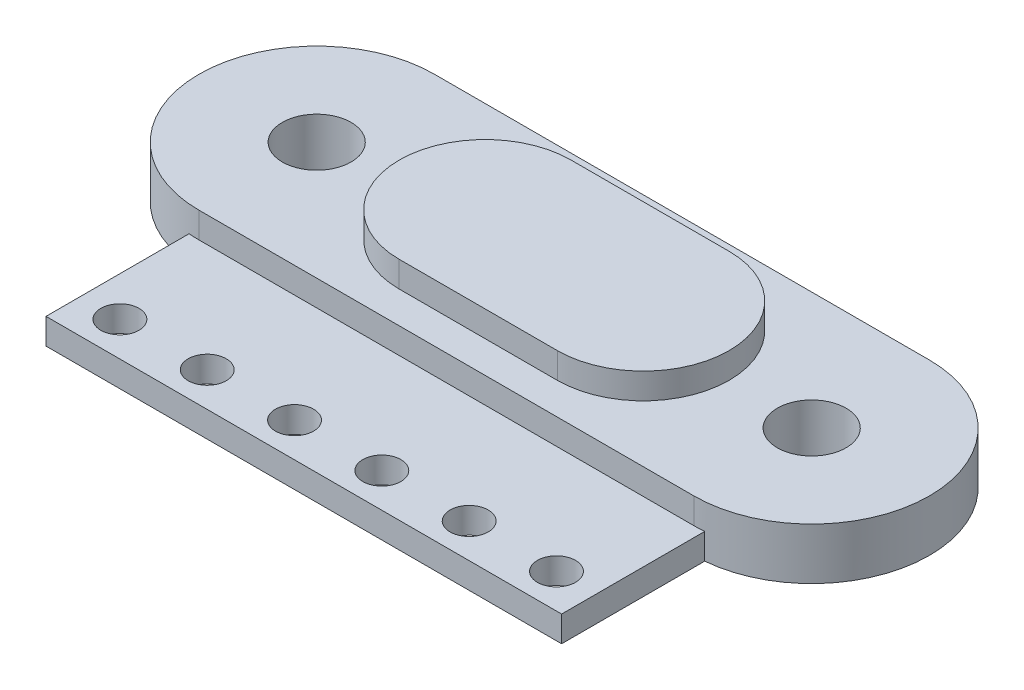
ISO-10303-21;
HEADER;
FILE_DESCRIPTION(('STEP AP214'),'2;1');
FILE_NAME('part.step','',(''),(''),'','','');
FILE_SCHEMA(('AUTOMOTIVE_DESIGN { 1 0 10303 214 1 1 1 1 }'));
ENDSEC;
DATA;
#1=APPLICATION_CONTEXT('core data for automotive mechanical design processes');
#2=APPLICATION_PROTOCOL_DEFINITION('international standard','automotive_design',2000,#1);
#3=PRODUCT_CONTEXT('',#1,'mechanical');
#4=PRODUCT('Part','Part','',(#3));
#5=PRODUCT_RELATED_PRODUCT_CATEGORY('part','',(#4));
#6=PRODUCT_DEFINITION_FORMATION('','',#4);
#7=PRODUCT_DEFINITION_CONTEXT('part definition',#1,'design');
#8=PRODUCT_DEFINITION('design','',#6,#7);
#9=PRODUCT_DEFINITION_SHAPE('','',#8);
#10=(LENGTH_UNIT() NAMED_UNIT(*) SI_UNIT(.MILLI.,.METRE.));
#11=(NAMED_UNIT(*) PLANE_ANGLE_UNIT() SI_UNIT($,.RADIAN.));
#12=(NAMED_UNIT(*) SI_UNIT($,.STERADIAN.) SOLID_ANGLE_UNIT());
#13=UNCERTAINTY_MEASURE_WITH_UNIT(LENGTH_MEASURE(1.E-05),#10,'distance_accuracy_value','');
#14=(GEOMETRIC_REPRESENTATION_CONTEXT(3) GLOBAL_UNCERTAINTY_ASSIGNED_CONTEXT((#13)) GLOBAL_UNIT_ASSIGNED_CONTEXT((#10,
#11,#12)) REPRESENTATION_CONTEXT('',''));
#15=CARTESIAN_POINT('',(0.,0.,0.));
#16=DIRECTION('',(0.,0.,1.));
#17=DIRECTION('',(1.,0.,0.));
#18=AXIS2_PLACEMENT_3D('',#15,#16,#17);
#19=CARTESIAN_POINT('',(-14.4,1.5,0.));
#20=DIRECTION('',(0.,1.,0.));
#21=DIRECTION('',(0.,0.,1.));
#22=AXIS2_PLACEMENT_3D('',#19,#20,#21);
#23=PLANE('',#22);
#24=CARTESIAN_POINT('',(-14.4,1.5,0.));
#25=DIRECTION('',(0.,1.,0.));
#26=DIRECTION('',(0.,0.,1.));
#27=AXIS2_PLACEMENT_3D('',#24,#25,#26);
#28=CIRCLE('',#27,1.);
#29=CARTESIAN_POINT('',(-14.4,1.5,1.));
#30=VERTEX_POINT('',#29);
#31=EDGE_CURVE('E334',#30,#30,#28,.T.);
#32=ORIENTED_EDGE('',*,*,#31,.F.);
#33=EDGE_LOOP('',(#32));
#34=FACE_BOUND('',#33,.T.);
#35=CARTESIAN_POINT('',(-14.4,1.5,0.));
#36=DIRECTION('',(0.,1.,0.));
#37=DIRECTION('',(0.,0.,1.));
#38=AXIS2_PLACEMENT_3D('',#35,#36,#37);
#39=CIRCLE('',#38,3.425);
#40=CARTESIAN_POINT('',(-14.4,1.5,-3.425));
#41=VERTEX_POINT('',#40);
#42=CARTESIAN_POINT('',(-14.4,1.5,3.425));
#43=VERTEX_POINT('',#42);
#44=EDGE_CURVE('E331',#41,#43,#39,.T.);
#45=ORIENTED_EDGE('',*,*,#44,.T.);
#46=DIRECTION('',(1.,0.,0.));
#47=VECTOR('',#46,1.);
#48=CARTESIAN_POINT('',(-14.4,1.5,3.425));
#49=LINE('',#48,#47);
#50=CARTESIAN_POINT('',(0.,1.5,3.425));
#51=VERTEX_POINT('',#50);
#52=EDGE_CURVE('E328',#43,#51,#49,.T.);
#53=ORIENTED_EDGE('',*,*,#52,.T.);
#54=CARTESIAN_POINT('',(0.,1.5,0.));
#55=DIRECTION('',(0.,1.,0.));
#56=DIRECTION('',(0.,0.,1.));
#57=AXIS2_PLACEMENT_3D('',#54,#55,#56);
#58=CIRCLE('',#57,3.425);
#59=CARTESIAN_POINT('',(0.,1.5,-3.425));
#60=VERTEX_POINT('',#59);
#61=EDGE_CURVE('E326',#51,#60,#58,.T.);
#62=ORIENTED_EDGE('',*,*,#61,.T.);
#63=DIRECTION('',(1.,0.,0.));
#64=VECTOR('',#63,1.);
#65=CARTESIAN_POINT('',(-14.4,1.5,-3.425));
#66=LINE('',#65,#64);
#67=EDGE_CURVE('E196',#41,#60,#66,.T.);
#68=ORIENTED_EDGE('',*,*,#67,.F.);
#69=EDGE_LOOP('',(#45,#53,#62,#68));
#70=FACE_BOUND('',#69,.T.);
#71=CARTESIAN_POINT('',(0.,1.5,0.));
#72=DIRECTION('',(0.,1.,0.));
#73=DIRECTION('',(0.,0.,1.));
#74=AXIS2_PLACEMENT_3D('',#71,#72,#73);
#75=CIRCLE('',#74,1.);
#76=CARTESIAN_POINT('',(0.,1.5,1.));
#77=VERTEX_POINT('',#76);
#78=EDGE_CURVE('E337',#77,#77,#75,.T.);
#79=ORIENTED_EDGE('',*,*,#78,.F.);
#80=EDGE_LOOP('',(#79));
#81=FACE_BOUND('',#80,.T.);
#82=DIRECTION('',(1.,0.,0.));
#83=VECTOR('',#82,1.);
#84=CARTESIAN_POINT('',(-9.5,1.5,2.5));
#85=LINE('',#84,#83);
#86=CARTESIAN_POINT('',(-9.5,1.5,2.5));
#87=VERTEX_POINT('',#86);
#88=CARTESIAN_POINT('',(-4.9,1.5,2.5));
#89=VERTEX_POINT('',#88);
#90=EDGE_CURVE('E356',#87,#89,#85,.T.);
#91=ORIENTED_EDGE('',*,*,#90,.F.);
#92=CARTESIAN_POINT('',(-9.5,1.5,0.));
#93=DIRECTION('',(0.,1.,0.));
#94=DIRECTION('',(0.,0.,1.));
#95=AXIS2_PLACEMENT_3D('',#92,#93,#94);
#96=CIRCLE('',#95,2.5);
#97=CARTESIAN_POINT('',(-9.5,1.5,-2.5));
#98=VERTEX_POINT('',#97);
#99=EDGE_CURVE('E359',#98,#87,#96,.T.);
#100=ORIENTED_EDGE('',*,*,#99,.F.);
#101=DIRECTION('',(-1.,0.,0.));
#102=VECTOR('',#101,1.);
#103=CARTESIAN_POINT('',(-9.5,1.5,-2.5));
#104=LINE('',#103,#102);
#105=CARTESIAN_POINT('',(-4.9,1.5,-2.5));
#106=VERTEX_POINT('',#105);
#107=EDGE_CURVE('E351',#106,#98,#104,.T.);
#108=ORIENTED_EDGE('',*,*,#107,.F.);
#109=CARTESIAN_POINT('',(-4.9,1.5,0.));
#110=DIRECTION('',(0.,1.,0.));
#111=DIRECTION('',(0.,0.,1.));
#112=AXIS2_PLACEMENT_3D('',#109,#110,#111);
#113=CIRCLE('',#112,2.5);
#114=EDGE_CURVE('E354',#89,#106,#113,.T.);
#115=ORIENTED_EDGE('',*,*,#114,.F.);
#116=EDGE_LOOP('',(#91,#100,#108,#115));
#117=FACE_BOUND('',#116,.T.);
#118=ADVANCED_FACE('F72',(#34,#70,#81,#117),#23,.T.);
#119=CARTESIAN_POINT('',(0.,0.75,0.));
#120=DIRECTION('',(0.,1.,0.));
#121=DIRECTION('',(0.,0.,1.));
#122=AXIS2_PLACEMENT_3D('',#119,#120,#121);
#123=PLANE('',#122);
#124=CARTESIAN_POINT('',(-0.849999999999998,0.75,6.575));
#125=DIRECTION('',(0.,1.,0.));
#126=DIRECTION('',(0.,0.,1.));
#127=AXIS2_PLACEMENT_3D('',#124,#125,#126);
#128=CIRCLE('',#127,0.554445531954672);
#129=CARTESIAN_POINT('',(-0.849999999999998,0.75,7.12944553195467));
#130=VERTEX_POINT('',#129);
#131=EDGE_CURVE('E128',#130,#130,#128,.F.);
#132=ORIENTED_EDGE('',*,*,#131,.T.);
#133=EDGE_LOOP('',(#132));
#134=FACE_BOUND('',#133,.T.);
#135=CARTESIAN_POINT('',(-5.93,0.75,6.575));
#136=DIRECTION('',(0.,1.,0.));
#137=DIRECTION('',(0.,0.,1.));
#138=AXIS2_PLACEMENT_3D('',#135,#136,#137);
#139=CIRCLE('',#138,0.554445531954672);
#140=CARTESIAN_POINT('',(-5.93,0.75,7.12944553195467));
#141=VERTEX_POINT('',#140);
#142=EDGE_CURVE('E228',#141,#141,#139,.F.);
#143=ORIENTED_EDGE('',*,*,#142,.T.);
#144=EDGE_LOOP('',(#143));
#145=FACE_BOUND('',#144,.T.);
#146=CARTESIAN_POINT('',(-13.55,0.75,6.575));
#147=DIRECTION('',(0.,1.,0.));
#148=DIRECTION('',(0.,0.,1.));
#149=AXIS2_PLACEMENT_3D('',#146,#147,#148);
#150=CIRCLE('',#149,0.554445531954672);
#151=CARTESIAN_POINT('',(-13.55,0.75,7.12944553195467));
#152=VERTEX_POINT('',#151);
#153=EDGE_CURVE('E226',#152,#152,#150,.T.);
#154=ORIENTED_EDGE('',*,*,#153,.F.);
#155=EDGE_LOOP('',(#154));
#156=FACE_BOUND('',#155,.T.);
#157=CARTESIAN_POINT('',(-11.01,0.75,6.575));
#158=DIRECTION('',(0.,1.,0.));
#159=DIRECTION('',(0.,0.,1.));
#160=AXIS2_PLACEMENT_3D('',#157,#158,#159);
#161=CIRCLE('',#160,0.554445531954671);
#162=CARTESIAN_POINT('',(-11.01,0.75,7.12944553195467));
#163=VERTEX_POINT('',#162);
#164=EDGE_CURVE('E223',#163,#163,#161,.T.);
#165=ORIENTED_EDGE('',*,*,#164,.F.);
#166=EDGE_LOOP('',(#165));
#167=FACE_BOUND('',#166,.T.);
#168=CARTESIAN_POINT('',(-8.47,0.75,6.575));
#169=DIRECTION('',(0.,1.,0.));
#170=DIRECTION('',(0.,0.,1.));
#171=AXIS2_PLACEMENT_3D('',#168,#169,#170);
#172=CIRCLE('',#171,0.554445531954672);
#173=CARTESIAN_POINT('',(-8.47,0.75,7.12944553195467));
#174=VERTEX_POINT('',#173);
#175=EDGE_CURVE('E220',#174,#174,#172,.T.);
#176=ORIENTED_EDGE('',*,*,#175,.F.);
#177=EDGE_LOOP('',(#176));
#178=FACE_BOUND('',#177,.T.);
#179=CARTESIAN_POINT('',(-3.39,0.75,6.575));
#180=DIRECTION('',(0.,1.,0.));
#181=DIRECTION('',(0.,0.,1.));
#182=AXIS2_PLACEMENT_3D('',#179,#180,#181);
#183=CIRCLE('',#182,0.55444553195467);
#184=CARTESIAN_POINT('',(-3.39,0.75,7.12944553195467));
#185=VERTEX_POINT('',#184);
#186=EDGE_CURVE('E214',#185,#185,#183,.F.);
#187=ORIENTED_EDGE('',*,*,#186,.T.);
#188=EDGE_LOOP('',(#187));
#189=FACE_BOUND('',#188,.T.);
#190=DIRECTION('',(-1.,0.,0.));
#191=VECTOR('',#190,1.);
#192=CARTESIAN_POINT('',(0.,0.75,3.425));
#193=LINE('',#192,#191);
#194=CARTESIAN_POINT('',(0.,0.75,3.425));
#195=VERTEX_POINT('',#194);
#196=CARTESIAN_POINT('',(-14.4,0.75,3.425));
#197=VERTEX_POINT('',#196);
#198=EDGE_CURVE('E151',#195,#197,#193,.T.);
#199=ORIENTED_EDGE('',*,*,#198,.T.);
#200=CARTESIAN_POINT('',(-14.4,0.75,0.));
#201=DIRECTION('',(0.,1.,0.));
#202=DIRECTION('',(0.,0.,1.));
#203=AXIS2_PLACEMENT_3D('',#200,#201,#202);
#204=CIRCLE('',#203,3.425);
#205=CARTESIAN_POINT('',(-14.7,0.75,3.41183601598904));
#206=VERTEX_POINT('',#205);
#207=EDGE_CURVE('E146',#197,#206,#204,.F.);
#208=ORIENTED_EDGE('',*,*,#207,.T.);
#209=DIRECTION('',(0.,0.,1.));
#210=VECTOR('',#209,1.);
#211=CARTESIAN_POINT('',(-14.7,0.75,0.));
#212=LINE('',#211,#210);
#213=CARTESIAN_POINT('',(-14.7,0.75,7.575));
#214=VERTEX_POINT('',#213);
#215=EDGE_CURVE('E211',#206,#214,#212,.T.);
#216=ORIENTED_EDGE('',*,*,#215,.T.);
#217=DIRECTION('',(1.,0.,0.));
#218=VECTOR('',#217,1.);
#219=CARTESIAN_POINT('',(0.,0.75,7.575));
#220=LINE('',#219,#218);
#221=CARTESIAN_POINT('',(0.3,0.75,7.575));
#222=VERTEX_POINT('',#221);
#223=EDGE_CURVE('E96',#214,#222,#220,.T.);
#224=ORIENTED_EDGE('',*,*,#223,.T.);
#225=DIRECTION('',(0.,0.,1.));
#226=VECTOR('',#225,1.);
#227=CARTESIAN_POINT('',(0.3,0.75,0.));
#228=LINE('',#227,#226);
#229=CARTESIAN_POINT('',(0.3,0.75,3.41183601598904));
#230=VERTEX_POINT('',#229);
#231=EDGE_CURVE('E125',#230,#222,#228,.T.);
#232=ORIENTED_EDGE('',*,*,#231,.F.);
#233=CARTESIAN_POINT('',(0.,0.75,0.));
#234=DIRECTION('',(0.,1.,0.));
#235=DIRECTION('',(0.,0.,1.));
#236=AXIS2_PLACEMENT_3D('',#233,#234,#235);
#237=CIRCLE('',#236,3.425);
#238=EDGE_CURVE('E312',#230,#195,#237,.F.);
#239=ORIENTED_EDGE('',*,*,#238,.T.);
#240=EDGE_LOOP('',(#199,#208,#216,#224,#232,#239));
#241=FACE_BOUND('',#240,.T.);
#242=ADVANCED_FACE('F235',(#134,#145,#156,#167,#178,#189,#241),#123,.T.);
#243=CARTESIAN_POINT('',(0.3,0.75,0.));
#244=DIRECTION('',(1.,0.,0.));
#245=DIRECTION('',(0.,0.,-1.));
#246=AXIS2_PLACEMENT_3D('',#243,#244,#245);
#247=PLANE('',#246);
#248=DIRECTION('',(0.,0.,1.));
#249=VECTOR('',#248,1.);
#250=CARTESIAN_POINT('',(0.3,0.,0.));
#251=LINE('',#250,#249);
#252=CARTESIAN_POINT('',(0.3,0.,3.41183601598904));
#253=VERTEX_POINT('',#252);
#254=CARTESIAN_POINT('',(0.3,0.,7.575));
#255=VERTEX_POINT('',#254);
#256=EDGE_CURVE('E124',#253,#255,#251,.T.);
#257=ORIENTED_EDGE('',*,*,#256,.F.);
#258=DIRECTION('',(0.,-1.,0.));
#259=VECTOR('',#258,1.);
#260=CARTESIAN_POINT('',(0.3,0.75,3.41183601598904));
#261=LINE('',#260,#259);
#262=EDGE_CURVE('E12',#230,#253,#261,.T.);
#263=ORIENTED_EDGE('',*,*,#262,.F.);
#264=ORIENTED_EDGE('',*,*,#231,.T.);
#265=DIRECTION('',(0.,-1.,0.));
#266=VECTOR('',#265,1.);
#267=CARTESIAN_POINT('',(0.3,0.75,7.575));
#268=LINE('',#267,#266);
#269=EDGE_CURVE('E120',#222,#255,#268,.T.);
#270=ORIENTED_EDGE('',*,*,#269,.T.);
#271=EDGE_LOOP('',(#257,#263,#264,#270));
#272=FACE_BOUND('',#271,.T.);
#273=ADVANCED_FACE('F74',(#272),#247,.T.);
#274=CARTESIAN_POINT('',(0.,0.75,0.));
#275=DIRECTION('',(0.,-1.,0.));
#276=DIRECTION('',(0.,0.,-1.));
#277=AXIS2_PLACEMENT_3D('',#274,#275,#276);
#278=CYLINDRICAL_SURFACE('',#277,3.425);
#279=CARTESIAN_POINT('',(0.,0.,0.));
#280=DIRECTION('',(0.,1.,0.));
#281=DIRECTION('',(0.,0.,1.));
#282=AXIS2_PLACEMENT_3D('',#279,#280,#281);
#283=CIRCLE('',#282,3.425);
#284=CARTESIAN_POINT('',(0.,0.,-3.425));
#285=VERTEX_POINT('',#284);
#286=EDGE_CURVE('E145',#253,#285,#283,.T.);
#287=ORIENTED_EDGE('',*,*,#286,.T.);
#288=DIRECTION('',(0.,-1.,0.));
#289=VECTOR('',#288,1.);
#290=CARTESIAN_POINT('',(0.,0.75,-3.425));
#291=LINE('',#290,#289);
#292=EDGE_CURVE('E80',#60,#285,#291,.T.);
#293=ORIENTED_EDGE('',*,*,#292,.F.);
#294=ORIENTED_EDGE('',*,*,#61,.F.);
#295=DIRECTION('',(0.,-1.,0.));
#296=VECTOR('',#295,1.);
#297=CARTESIAN_POINT('',(0.,1.5,3.425));
#298=LINE('',#297,#296);
#299=EDGE_CURVE('E323',#51,#195,#298,.T.);
#300=ORIENTED_EDGE('',*,*,#299,.T.);
#301=ORIENTED_EDGE('',*,*,#238,.F.);
#302=ORIENTED_EDGE('',*,*,#262,.T.);
#303=EDGE_LOOP('',(#287,#293,#294,#300,#301,#302));
#304=FACE_BOUND('',#303,.T.);
#305=ADVANCED_FACE('F200',(#304),#278,.T.);
#306=CARTESIAN_POINT('',(0.,0.75,-3.425));
#307=DIRECTION('',(0.,0.,-1.));
#308=DIRECTION('',(-1.,0.,0.));
#309=AXIS2_PLACEMENT_3D('',#306,#307,#308);
#310=PLANE('',#309);
#311=DIRECTION('',(1.,0.,0.));
#312=VECTOR('',#311,1.);
#313=CARTESIAN_POINT('',(0.,0.,-3.425));
#314=LINE('',#313,#312);
#315=CARTESIAN_POINT('',(-14.4,0.,-3.425));
#316=VERTEX_POINT('',#315);
#317=EDGE_CURVE('E148',#316,#285,#314,.T.);
#318=ORIENTED_EDGE('',*,*,#317,.F.);
#319=DIRECTION('',(0.,-1.,0.));
#320=VECTOR('',#319,1.);
#321=CARTESIAN_POINT('',(-14.4,0.75,-3.425));
#322=LINE('',#321,#320);
#323=EDGE_CURVE('E187',#41,#316,#322,.T.);
#324=ORIENTED_EDGE('',*,*,#323,.F.);
#325=ORIENTED_EDGE('',*,*,#67,.T.);
#326=ORIENTED_EDGE('',*,*,#292,.T.);
#327=EDGE_LOOP('',(#318,#324,#325,#326));
#328=FACE_BOUND('',#327,.T.);
#329=ADVANCED_FACE('F192',(#328),#310,.T.);
#330=CARTESIAN_POINT('',(-14.4,0.75,0.));
#331=DIRECTION('',(0.,-1.,0.));
#332=DIRECTION('',(0.,0.,-1.));
#333=AXIS2_PLACEMENT_3D('',#330,#331,#332);
#334=CYLINDRICAL_SURFACE('',#333,3.425);
#335=CARTESIAN_POINT('',(-14.4,0.,0.));
#336=DIRECTION('',(0.,1.,0.));
#337=DIRECTION('',(0.,0.,1.));
#338=AXIS2_PLACEMENT_3D('',#335,#336,#337);
#339=CIRCLE('',#338,3.425);
#340=CARTESIAN_POINT('',(-14.7,0.,3.41183601598904));
#341=VERTEX_POINT('',#340);
#342=EDGE_CURVE('E157',#316,#341,#339,.T.);
#343=ORIENTED_EDGE('',*,*,#342,.T.);
#344=DIRECTION('',(0.,-1.,0.));
#345=VECTOR('',#344,1.);
#346=CARTESIAN_POINT('',(-14.7,0.75,3.41183601598904));
#347=LINE('',#346,#345);
#348=EDGE_CURVE('E184',#206,#341,#347,.T.);
#349=ORIENTED_EDGE('',*,*,#348,.F.);
#350=ORIENTED_EDGE('',*,*,#207,.F.);
#351=DIRECTION('',(0.,-1.,0.));
#352=VECTOR('',#351,1.);
#353=CARTESIAN_POINT('',(-14.4,1.5,3.425));
#354=LINE('',#353,#352);
#355=EDGE_CURVE('E319',#43,#197,#354,.T.);
#356=ORIENTED_EDGE('',*,*,#355,.F.);
#357=ORIENTED_EDGE('',*,*,#44,.F.);
#358=ORIENTED_EDGE('',*,*,#323,.T.);
#359=EDGE_LOOP('',(#343,#349,#350,#356,#357,#358));
#360=FACE_BOUND('',#359,.T.);
#361=ADVANCED_FACE('F205',(#360),#334,.T.);
#362=CARTESIAN_POINT('',(-14.7,0.75,0.));
#363=DIRECTION('',(1.,0.,0.));
#364=DIRECTION('',(0.,0.,-1.));
#365=AXIS2_PLACEMENT_3D('',#362,#363,#364);
#366=PLANE('',#365);
#367=DIRECTION('',(0.,0.,1.));
#368=VECTOR('',#367,1.);
#369=CARTESIAN_POINT('',(-14.7,0.,0.));
#370=LINE('',#369,#368);
#371=CARTESIAN_POINT('',(-14.7,0.,7.575));
#372=VERTEX_POINT('',#371);
#373=EDGE_CURVE('E138',#341,#372,#370,.T.);
#374=ORIENTED_EDGE('',*,*,#373,.T.);
#375=DIRECTION('',(0.,-1.,0.));
#376=VECTOR('',#375,1.);
#377=CARTESIAN_POINT('',(-14.7,0.75,7.575));
#378=LINE('',#377,#376);
#379=EDGE_CURVE('E127',#214,#372,#378,.T.);
#380=ORIENTED_EDGE('',*,*,#379,.F.);
#381=ORIENTED_EDGE('',*,*,#215,.F.);
#382=ORIENTED_EDGE('',*,*,#348,.T.);
#383=EDGE_LOOP('',(#374,#380,#381,#382));
#384=FACE_BOUND('',#383,.T.);
#385=ADVANCED_FACE('F210',(#384),#366,.F.);
#386=CARTESIAN_POINT('',(-5.93,0.75,6.575));
#387=DIRECTION('',(0.,-1.,0.));
#388=DIRECTION('',(0.,0.,-1.));
#389=AXIS2_PLACEMENT_3D('',#386,#387,#388);
#390=CYLINDRICAL_SURFACE('',#389,0.554445531954672);
#391=ORIENTED_EDGE('',*,*,#142,.F.);
#392=EDGE_LOOP('',(#391));
#393=FACE_BOUND('',#392,.T.);
#394=CARTESIAN_POINT('',(-5.93,0.,6.575));
#395=DIRECTION('',(0.,1.,0.));
#396=DIRECTION('',(0.,0.,1.));
#397=AXIS2_PLACEMENT_3D('',#394,#395,#396);
#398=CIRCLE('',#397,0.554445531954672);
#399=CARTESIAN_POINT('',(-5.93,0.,7.12944553195467));
#400=VERTEX_POINT('',#399);
#401=EDGE_CURVE('E177',#400,#400,#398,.F.);
#402=ORIENTED_EDGE('',*,*,#401,.T.);
#403=EDGE_LOOP('',(#402));
#404=FACE_BOUND('',#403,.T.);
#405=ADVANCED_FACE('F290',(#393,#404),#390,.F.);
#406=CARTESIAN_POINT('',(-13.55,0.75,6.575));
#407=DIRECTION('',(0.,-1.,0.));
#408=DIRECTION('',(0.,0.,-1.));
#409=AXIS2_PLACEMENT_3D('',#406,#407,#408);
#410=CYLINDRICAL_SURFACE('',#409,0.554445531954672);
#411=ORIENTED_EDGE('',*,*,#153,.T.);
#412=EDGE_LOOP('',(#411));
#413=FACE_BOUND('',#412,.T.);
#414=CARTESIAN_POINT('',(-13.55,0.,6.575));
#415=DIRECTION('',(0.,1.,0.));
#416=DIRECTION('',(0.,0.,1.));
#417=AXIS2_PLACEMENT_3D('',#414,#415,#416);
#418=CIRCLE('',#417,0.554445531954672);
#419=CARTESIAN_POINT('',(-13.55,0.,7.12944553195467));
#420=VERTEX_POINT('',#419);
#421=EDGE_CURVE('E174',#420,#420,#418,.T.);
#422=ORIENTED_EDGE('',*,*,#421,.F.);
#423=EDGE_LOOP('',(#422));
#424=FACE_BOUND('',#423,.T.);
#425=ADVANCED_FACE('F293',(#413,#424),#410,.F.);
#426=CARTESIAN_POINT('',(-11.01,0.75,6.575));
#427=DIRECTION('',(0.,-1.,0.));
#428=DIRECTION('',(0.,0.,-1.));
#429=AXIS2_PLACEMENT_3D('',#426,#427,#428);
#430=CYLINDRICAL_SURFACE('',#429,0.554445531954671);
#431=ORIENTED_EDGE('',*,*,#164,.T.);
#432=EDGE_LOOP('',(#431));
#433=FACE_BOUND('',#432,.T.);
#434=CARTESIAN_POINT('',(-11.01,0.,6.575));
#435=DIRECTION('',(0.,1.,0.));
#436=DIRECTION('',(0.,0.,1.));
#437=AXIS2_PLACEMENT_3D('',#434,#435,#436);
#438=CIRCLE('',#437,0.554445531954671);
#439=CARTESIAN_POINT('',(-11.01,0.,7.12944553195467));
#440=VERTEX_POINT('',#439);
#441=EDGE_CURVE('E171',#440,#440,#438,.T.);
#442=ORIENTED_EDGE('',*,*,#441,.F.);
#443=EDGE_LOOP('',(#442));
#444=FACE_BOUND('',#443,.T.);
#445=ADVANCED_FACE('F270',(#433,#444),#430,.F.);
#446=CARTESIAN_POINT('',(-8.47,0.75,6.575));
#447=DIRECTION('',(0.,-1.,0.));
#448=DIRECTION('',(0.,0.,-1.));
#449=AXIS2_PLACEMENT_3D('',#446,#447,#448);
#450=CYLINDRICAL_SURFACE('',#449,0.554445531954672);
#451=ORIENTED_EDGE('',*,*,#175,.T.);
#452=EDGE_LOOP('',(#451));
#453=FACE_BOUND('',#452,.T.);
#454=CARTESIAN_POINT('',(-8.47,0.,6.575));
#455=DIRECTION('',(0.,1.,0.));
#456=DIRECTION('',(0.,0.,1.));
#457=AXIS2_PLACEMENT_3D('',#454,#455,#456);
#458=CIRCLE('',#457,0.554445531954672);
#459=CARTESIAN_POINT('',(-8.47,0.,7.12944553195467));
#460=VERTEX_POINT('',#459);
#461=EDGE_CURVE('E168',#460,#460,#458,.T.);
#462=ORIENTED_EDGE('',*,*,#461,.F.);
#463=EDGE_LOOP('',(#462));
#464=FACE_BOUND('',#463,.T.);
#465=ADVANCED_FACE('F260',(#453,#464),#450,.F.);
#466=CARTESIAN_POINT('',(-3.39,0.75,6.575));
#467=DIRECTION('',(0.,-1.,0.));
#468=DIRECTION('',(0.,0.,-1.));
#469=AXIS2_PLACEMENT_3D('',#466,#467,#468);
#470=CYLINDRICAL_SURFACE('',#469,0.55444553195467);
#471=ORIENTED_EDGE('',*,*,#186,.F.);
#472=EDGE_LOOP('',(#471));
#473=FACE_BOUND('',#472,.T.);
#474=CARTESIAN_POINT('',(-3.39,0.,6.575));
#475=DIRECTION('',(0.,1.,0.));
#476=DIRECTION('',(0.,0.,1.));
#477=AXIS2_PLACEMENT_3D('',#474,#475,#476);
#478=CIRCLE('',#477,0.55444553195467);
#479=CARTESIAN_POINT('',(-3.39,0.,7.12944553195467));
#480=VERTEX_POINT('',#479);
#481=EDGE_CURVE('E165',#480,#480,#478,.F.);
#482=ORIENTED_EDGE('',*,*,#481,.T.);
#483=EDGE_LOOP('',(#482));
#484=FACE_BOUND('',#483,.T.);
#485=ADVANCED_FACE('F257',(#473,#484),#470,.F.);
#486=CARTESIAN_POINT('',(0.,0.75,0.));
#487=DIRECTION('',(0.,-1.,0.));
#488=DIRECTION('',(0.,0.,-1.));
#489=AXIS2_PLACEMENT_3D('',#486,#487,#488);
#490=CYLINDRICAL_SURFACE('',#489,1.);
#491=CARTESIAN_POINT('',(0.,0.,0.));
#492=DIRECTION('',(0.,1.,0.));
#493=DIRECTION('',(0.,0.,1.));
#494=AXIS2_PLACEMENT_3D('',#491,#492,#493);
#495=CIRCLE('',#494,1.);
#496=CARTESIAN_POINT('',(0.,0.,1.));
#497=VERTEX_POINT('',#496);
#498=EDGE_CURVE('E162',#497,#497,#495,.T.);
#499=ORIENTED_EDGE('',*,*,#498,.F.);
#500=EDGE_LOOP('',(#499));
#501=FACE_BOUND('',#500,.T.);
#502=ORIENTED_EDGE('',*,*,#78,.T.);
#503=EDGE_LOOP('',(#502));
#504=FACE_BOUND('',#503,.T.);
#505=ADVANCED_FACE('F259',(#501,#504),#490,.F.);
#506=CARTESIAN_POINT('',(-14.4,0.75,0.));
#507=DIRECTION('',(0.,-1.,0.));
#508=DIRECTION('',(0.,0.,-1.));
#509=AXIS2_PLACEMENT_3D('',#506,#507,#508);
#510=CYLINDRICAL_SURFACE('',#509,1.);
#511=CARTESIAN_POINT('',(-14.4,0.,0.));
#512=DIRECTION('',(0.,1.,0.));
#513=DIRECTION('',(0.,0.,1.));
#514=AXIS2_PLACEMENT_3D('',#511,#512,#513);
#515=CIRCLE('',#514,1.);
#516=CARTESIAN_POINT('',(-14.4,0.,1.));
#517=VERTEX_POINT('',#516);
#518=EDGE_CURVE('E137',#517,#517,#515,.T.);
#519=ORIENTED_EDGE('',*,*,#518,.F.);
#520=EDGE_LOOP('',(#519));
#521=FACE_BOUND('',#520,.T.);
#522=ORIENTED_EDGE('',*,*,#31,.T.);
#523=EDGE_LOOP('',(#522));
#524=FACE_BOUND('',#523,.T.);
#525=ADVANCED_FACE('F267',(#521,#524),#510,.F.);
#526=CARTESIAN_POINT('',(0.,0.75,7.575));
#527=DIRECTION('',(0.,0.,-1.));
#528=DIRECTION('',(-1.,0.,0.));
#529=AXIS2_PLACEMENT_3D('',#526,#527,#528);
#530=PLANE('',#529);
#531=DIRECTION('',(1.,0.,0.));
#532=VECTOR('',#531,1.);
#533=CARTESIAN_POINT('',(0.,0.,7.575));
#534=LINE('',#533,#532);
#535=EDGE_CURVE('E132',#372,#255,#534,.T.);
#536=ORIENTED_EDGE('',*,*,#535,.T.);
#537=ORIENTED_EDGE('',*,*,#269,.F.);
#538=ORIENTED_EDGE('',*,*,#223,.F.);
#539=ORIENTED_EDGE('',*,*,#379,.T.);
#540=EDGE_LOOP('',(#536,#537,#538,#539));
#541=FACE_BOUND('',#540,.T.);
#542=ADVANCED_FACE('F133',(#541),#530,.F.);
#543=CARTESIAN_POINT('',(-0.849999999999998,0.75,6.575));
#544=DIRECTION('',(0.,-1.,0.));
#545=DIRECTION('',(0.,0.,-1.));
#546=AXIS2_PLACEMENT_3D('',#543,#544,#545);
#547=CYLINDRICAL_SURFACE('',#546,0.554445531954672);
#548=ORIENTED_EDGE('',*,*,#131,.F.);
#549=EDGE_LOOP('',(#548));
#550=FACE_BOUND('',#549,.T.);
#551=CARTESIAN_POINT('',(-0.849999999999998,0.,6.575));
#552=DIRECTION('',(0.,1.,0.));
#553=DIRECTION('',(0.,0.,1.));
#554=AXIS2_PLACEMENT_3D('',#551,#552,#553);
#555=CIRCLE('',#554,0.554445531954672);
#556=CARTESIAN_POINT('',(-0.849999999999998,0.,7.12944553195467));
#557=VERTEX_POINT('',#556);
#558=EDGE_CURVE('E180',#557,#557,#555,.F.);
#559=ORIENTED_EDGE('',*,*,#558,.T.);
#560=EDGE_LOOP('',(#559));
#561=FACE_BOUND('',#560,.T.);
#562=ADVANCED_FACE('F237',(#550,#561),#547,.F.);
#563=CARTESIAN_POINT('',(0.,0.,0.));
#564=DIRECTION('',(0.,1.,0.));
#565=DIRECTION('',(0.,0.,1.));
#566=AXIS2_PLACEMENT_3D('',#563,#564,#565);
#567=PLANE('',#566);
#568=ORIENTED_EDGE('',*,*,#373,.F.);
#569=ORIENTED_EDGE('',*,*,#342,.F.);
#570=ORIENTED_EDGE('',*,*,#317,.T.);
#571=ORIENTED_EDGE('',*,*,#286,.F.);
#572=ORIENTED_EDGE('',*,*,#256,.T.);
#573=ORIENTED_EDGE('',*,*,#535,.F.);
#574=EDGE_LOOP('',(#568,#569,#570,#571,#572,#573));
#575=FACE_BOUND('',#574,.T.);
#576=ORIENTED_EDGE('',*,*,#518,.T.);
#577=EDGE_LOOP('',(#576));
#578=FACE_BOUND('',#577,.T.);
#579=ORIENTED_EDGE('',*,*,#498,.T.);
#580=EDGE_LOOP('',(#579));
#581=FACE_BOUND('',#580,.T.);
#582=ORIENTED_EDGE('',*,*,#558,.F.);
#583=EDGE_LOOP('',(#582));
#584=FACE_BOUND('',#583,.T.);
#585=ORIENTED_EDGE('',*,*,#401,.F.);
#586=EDGE_LOOP('',(#585));
#587=FACE_BOUND('',#586,.T.);
#588=ORIENTED_EDGE('',*,*,#421,.T.);
#589=EDGE_LOOP('',(#588));
#590=FACE_BOUND('',#589,.T.);
#591=ORIENTED_EDGE('',*,*,#441,.T.);
#592=EDGE_LOOP('',(#591));
#593=FACE_BOUND('',#592,.T.);
#594=ORIENTED_EDGE('',*,*,#461,.T.);
#595=EDGE_LOOP('',(#594));
#596=FACE_BOUND('',#595,.T.);
#597=ORIENTED_EDGE('',*,*,#481,.F.);
#598=EDGE_LOOP('',(#597));
#599=FACE_BOUND('',#598,.T.);
#600=ADVANCED_FACE('F141',(#575,#578,#581,#584,#587,#590,#593,#596,#599),#567,.F.);
#601=CARTESIAN_POINT('',(-14.4,1.5,3.425));
#602=DIRECTION('',(0.,0.,-1.));
#603=DIRECTION('',(-1.,0.,0.));
#604=AXIS2_PLACEMENT_3D('',#601,#602,#603);
#605=PLANE('',#604);
#606=ORIENTED_EDGE('',*,*,#198,.F.);
#607=ORIENTED_EDGE('',*,*,#299,.F.);
#608=ORIENTED_EDGE('',*,*,#52,.F.);
#609=ORIENTED_EDGE('',*,*,#355,.T.);
#610=EDGE_LOOP('',(#606,#607,#608,#609));
#611=FACE_BOUND('',#610,.T.);
#612=ADVANCED_FACE('F245',(#611),#605,.F.);
#613=CARTESIAN_POINT('',(-9.5,2.25,0.));
#614=DIRECTION('',(0.,-1.,0.));
#615=DIRECTION('',(0.,0.,-1.));
#616=AXIS2_PLACEMENT_3D('',#613,#614,#615);
#617=CYLINDRICAL_SURFACE('',#616,2.5);
#618=ORIENTED_EDGE('',*,*,#99,.T.);
#619=DIRECTION('',(0.,-1.,0.));
#620=VECTOR('',#619,1.);
#621=CARTESIAN_POINT('',(-9.5,2.25,2.5));
#622=LINE('',#621,#620);
#623=CARTESIAN_POINT('',(-9.5,2.25,2.5));
#624=VERTEX_POINT('',#623);
#625=EDGE_CURVE('E340',#624,#87,#622,.T.);
#626=ORIENTED_EDGE('',*,*,#625,.F.);
#627=CARTESIAN_POINT('',(-9.5,2.25,0.));
#628=DIRECTION('',(0.,1.,0.));
#629=DIRECTION('',(0.,0.,1.));
#630=AXIS2_PLACEMENT_3D('',#627,#628,#629);
#631=CIRCLE('',#630,2.5);
#632=CARTESIAN_POINT('',(-9.5,2.25,-2.5));
#633=VERTEX_POINT('',#632);
#634=EDGE_CURVE('E353',#633,#624,#631,.T.);
#635=ORIENTED_EDGE('',*,*,#634,.F.);
#636=DIRECTION('',(0.,-1.,0.));
#637=VECTOR('',#636,1.);
#638=CARTESIAN_POINT('',(-9.5,2.25,-2.5));
#639=LINE('',#638,#637);
#640=EDGE_CURVE('E347',#633,#98,#639,.T.);
#641=ORIENTED_EDGE('',*,*,#640,.T.);
#642=EDGE_LOOP('',(#618,#626,#635,#641));
#643=FACE_BOUND('',#642,.T.);
#644=ADVANCED_FACE('F285',(#643),#617,.T.);
#645=CARTESIAN_POINT('',(-9.5,2.25,2.5));
#646=DIRECTION('',(0.,0.,-1.));
#647=DIRECTION('',(-1.,0.,0.));
#648=AXIS2_PLACEMENT_3D('',#645,#646,#647);
#649=PLANE('',#648);
#650=ORIENTED_EDGE('',*,*,#90,.T.);
#651=DIRECTION('',(0.,-1.,0.));
#652=VECTOR('',#651,1.);
#653=CARTESIAN_POINT('',(-4.9,2.25,2.5));
#654=LINE('',#653,#652);
#655=CARTESIAN_POINT('',(-4.9,2.25,2.5));
#656=VERTEX_POINT('',#655);
#657=EDGE_CURVE('E343',#656,#89,#654,.T.);
#658=ORIENTED_EDGE('',*,*,#657,.F.);
#659=DIRECTION('',(1.,0.,0.));
#660=VECTOR('',#659,1.);
#661=CARTESIAN_POINT('',(-9.5,2.25,2.5));
#662=LINE('',#661,#660);
#663=EDGE_CURVE('E367',#624,#656,#662,.T.);
#664=ORIENTED_EDGE('',*,*,#663,.F.);
#665=ORIENTED_EDGE('',*,*,#625,.T.);
#666=EDGE_LOOP('',(#650,#658,#664,#665));
#667=FACE_BOUND('',#666,.T.);
#668=ADVANCED_FACE('F388',(#667),#649,.F.);
#669=CARTESIAN_POINT('',(-4.9,2.25,0.));
#670=DIRECTION('',(0.,-1.,0.));
#671=DIRECTION('',(0.,0.,-1.));
#672=AXIS2_PLACEMENT_3D('',#669,#670,#671);
#673=CYLINDRICAL_SURFACE('',#672,2.5);
#674=ORIENTED_EDGE('',*,*,#114,.T.);
#675=DIRECTION('',(0.,-1.,0.));
#676=VECTOR('',#675,1.);
#677=CARTESIAN_POINT('',(-4.9,2.25,-2.5));
#678=LINE('',#677,#676);
#679=CARTESIAN_POINT('',(-4.9,2.25,-2.5));
#680=VERTEX_POINT('',#679);
#681=EDGE_CURVE('E87',#680,#106,#678,.T.);
#682=ORIENTED_EDGE('',*,*,#681,.F.);
#683=CARTESIAN_POINT('',(-4.9,2.25,0.));
#684=DIRECTION('',(0.,1.,0.));
#685=DIRECTION('',(0.,0.,1.));
#686=AXIS2_PLACEMENT_3D('',#683,#684,#685);
#687=CIRCLE('',#686,2.5);
#688=EDGE_CURVE('E364',#656,#680,#687,.T.);
#689=ORIENTED_EDGE('',*,*,#688,.F.);
#690=ORIENTED_EDGE('',*,*,#657,.T.);
#691=EDGE_LOOP('',(#674,#682,#689,#690));
#692=FACE_BOUND('',#691,.T.);
#693=ADVANCED_FACE('F412',(#692),#673,.T.);
#694=CARTESIAN_POINT('',(-9.5,2.25,-2.5));
#695=DIRECTION('',(0.,0.,1.));
#696=DIRECTION('',(1.,0.,0.));
#697=AXIS2_PLACEMENT_3D('',#694,#695,#696);
#698=PLANE('',#697);
#699=ORIENTED_EDGE('',*,*,#107,.T.);
#700=ORIENTED_EDGE('',*,*,#640,.F.);
#701=DIRECTION('',(-1.,0.,0.));
#702=VECTOR('',#701,1.);
#703=CARTESIAN_POINT('',(-9.5,2.25,-2.5));
#704=LINE('',#703,#702);
#705=EDGE_CURVE('E350',#680,#633,#704,.T.);
#706=ORIENTED_EDGE('',*,*,#705,.F.);
#707=ORIENTED_EDGE('',*,*,#681,.T.);
#708=EDGE_LOOP('',(#699,#700,#706,#707));
#709=FACE_BOUND('',#708,.T.);
#710=ADVANCED_FACE('F416',(#709),#698,.F.);
#711=CARTESIAN_POINT('',(-9.5,2.25,0.));
#712=DIRECTION('',(0.,1.,0.));
#713=DIRECTION('',(0.,0.,1.));
#714=AXIS2_PLACEMENT_3D('',#711,#712,#713);
#715=PLANE('',#714);
#716=ORIENTED_EDGE('',*,*,#634,.T.);
#717=ORIENTED_EDGE('',*,*,#663,.T.);
#718=ORIENTED_EDGE('',*,*,#688,.T.);
#719=ORIENTED_EDGE('',*,*,#705,.T.);
#720=EDGE_LOOP('',(#716,#717,#718,#719));
#721=FACE_BOUND('',#720,.T.);
#722=ADVANCED_FACE('F375',(#721),#715,.T.);
#723=CLOSED_SHELL('',(#118,#242,#273,#305,#329,#361,#385,#405,#425,#445,#465,#485,#505,#525,
#542,#562,#600,#612,#644,#668,#693,#710,#722));
#724=MANIFOLD_SOLID_BREP('B2',#723);
#725=ADVANCED_BREP_SHAPE_REPRESENTATION('',(#18,#724),#14);
#726=SHAPE_DEFINITION_REPRESENTATION(#9,#725);
ENDSEC;
END-ISO-10303-21;
